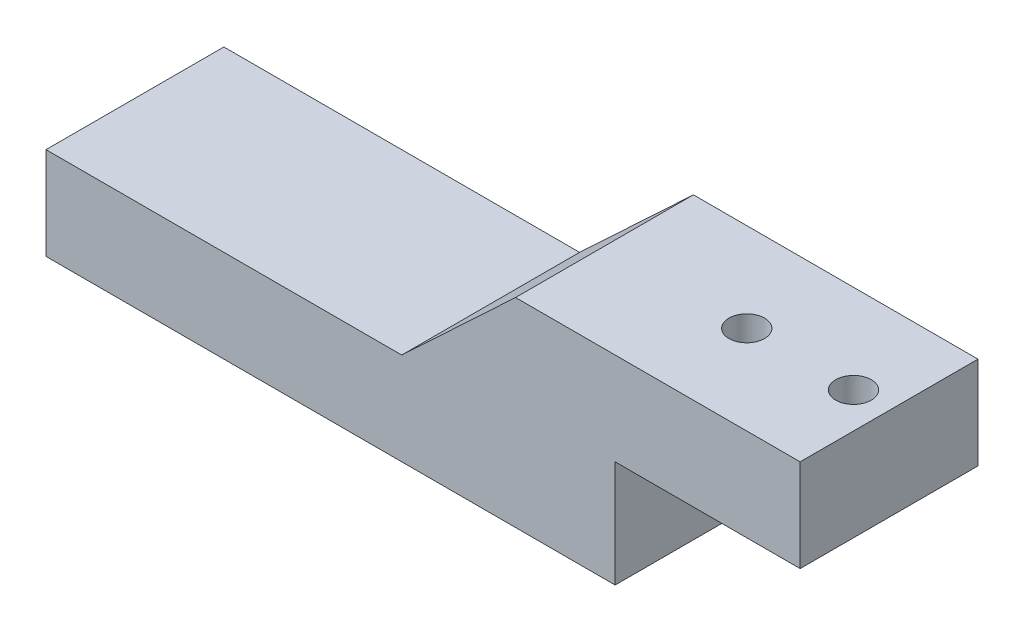
ISO-10303-21;
HEADER;
FILE_DESCRIPTION(('STEP AP214'),'2;1');
FILE_NAME('part.step','',(''),(''),'','','');
FILE_SCHEMA(('AUTOMOTIVE_DESIGN { 1 0 10303 214 1 1 1 1 }'));
ENDSEC;
DATA;
#1=APPLICATION_CONTEXT('core data for automotive mechanical design processes');
#2=APPLICATION_PROTOCOL_DEFINITION('international standard','automotive_design',2000,#1);
#3=PRODUCT_CONTEXT('',#1,'mechanical');
#4=PRODUCT('Part','Part','',(#3));
#5=PRODUCT_RELATED_PRODUCT_CATEGORY('part','',(#4));
#6=PRODUCT_DEFINITION_FORMATION('','',#4);
#7=PRODUCT_DEFINITION_CONTEXT('part definition',#1,'design');
#8=PRODUCT_DEFINITION('design','',#6,#7);
#9=PRODUCT_DEFINITION_SHAPE('','',#8);
#10=(LENGTH_UNIT() NAMED_UNIT(*) SI_UNIT(.MILLI.,.METRE.));
#11=(NAMED_UNIT(*) PLANE_ANGLE_UNIT() SI_UNIT($,.RADIAN.));
#12=(NAMED_UNIT(*) SI_UNIT($,.STERADIAN.) SOLID_ANGLE_UNIT());
#13=UNCERTAINTY_MEASURE_WITH_UNIT(LENGTH_MEASURE(1.E-05),#10,'distance_accuracy_value','');
#14=(GEOMETRIC_REPRESENTATION_CONTEXT(3) GLOBAL_UNCERTAINTY_ASSIGNED_CONTEXT((#13)) GLOBAL_UNIT_ASSIGNED_CONTEXT((#10,
#11,#12)) REPRESENTATION_CONTEXT('',''));
#15=CARTESIAN_POINT('',(0.,0.,0.));
#16=DIRECTION('',(0.,0.,1.));
#17=DIRECTION('',(1.,0.,0.));
#18=AXIS2_PLACEMENT_3D('',#15,#16,#17);
#19=CARTESIAN_POINT('',(0.,0.,25.));
#20=DIRECTION('',(0.,1.,0.));
#21=DIRECTION('',(0.,0.,1.));
#22=AXIS2_PLACEMENT_3D('',#19,#20,#21);
#23=PLANE('',#22);
#24=DIRECTION('',(1.,0.,0.));
#25=VECTOR('',#24,1.);
#26=CARTESIAN_POINT('',(0.,0.,0.));
#27=LINE('',#26,#25);
#28=CARTESIAN_POINT('',(-24.7635869565218,0.,0.));
#29=VERTEX_POINT('',#28);
#30=CARTESIAN_POINT('',(55.2364130434782,0.,0.));
#31=VERTEX_POINT('',#30);
#32=EDGE_CURVE('E84',#29,#31,#27,.T.);
#33=ORIENTED_EDGE('',*,*,#32,.T.);
#34=DIRECTION('',(0.,0.,-1.));
#35=VECTOR('',#34,1.);
#36=CARTESIAN_POINT('',(55.2364130434782,0.,25.));
#37=LINE('',#36,#35);
#38=CARTESIAN_POINT('',(55.2364130434782,0.,25.));
#39=VERTEX_POINT('',#38);
#40=EDGE_CURVE('E11',#39,#31,#37,.T.);
#41=ORIENTED_EDGE('',*,*,#40,.F.);
#42=DIRECTION('',(1.,0.,0.));
#43=VECTOR('',#42,1.);
#44=CARTESIAN_POINT('',(-24.7635869565218,0.,25.));
#45=LINE('',#44,#43);
#46=CARTESIAN_POINT('',(-24.7635869565218,0.,25.));
#47=VERTEX_POINT('',#46);
#48=EDGE_CURVE('E90',#47,#39,#45,.T.);
#49=ORIENTED_EDGE('',*,*,#48,.F.);
#50=DIRECTION('',(0.,0.,-1.));
#51=VECTOR('',#50,1.);
#52=CARTESIAN_POINT('',(-24.7635869565218,0.,25.));
#53=LINE('',#52,#51);
#54=EDGE_CURVE('E124',#47,#29,#53,.T.);
#55=ORIENTED_EDGE('',*,*,#54,.T.);
#56=EDGE_LOOP('',(#33,#41,#49,#55));
#57=FACE_BOUND('',#56,.T.);
#58=ADVANCED_FACE('F32',(#57),#23,.F.);
#59=CARTESIAN_POINT('',(55.2364130434782,0.,25.));
#60=DIRECTION('',(-1.,0.,0.));
#61=DIRECTION('',(0.,0.,1.));
#62=AXIS2_PLACEMENT_3D('',#59,#60,#61);
#63=PLANE('',#62);
#64=DIRECTION('',(0.,1.,0.));
#65=VECTOR('',#64,1.);
#66=CARTESIAN_POINT('',(55.2364130434782,0.,0.));
#67=LINE('',#66,#65);
#68=CARTESIAN_POINT('',(55.2364130434782,15.,0.));
#69=VERTEX_POINT('',#68);
#70=EDGE_CURVE('E129',#31,#69,#67,.T.);
#71=ORIENTED_EDGE('',*,*,#70,.T.);
#72=DIRECTION('',(0.,0.,-1.));
#73=VECTOR('',#72,1.);
#74=CARTESIAN_POINT('',(55.2364130434782,15.,25.));
#75=LINE('',#74,#73);
#76=CARTESIAN_POINT('',(55.2364130434782,15.,25.));
#77=VERTEX_POINT('',#76);
#78=EDGE_CURVE('E40',#77,#69,#75,.T.);
#79=ORIENTED_EDGE('',*,*,#78,.F.);
#80=DIRECTION('',(0.,1.,0.));
#81=VECTOR('',#80,1.);
#82=CARTESIAN_POINT('',(55.2364130434782,0.,25.));
#83=LINE('',#82,#81);
#84=EDGE_CURVE('E174',#39,#77,#83,.T.);
#85=ORIENTED_EDGE('',*,*,#84,.F.);
#86=ORIENTED_EDGE('',*,*,#40,.T.);
#87=EDGE_LOOP('',(#71,#79,#85,#86));
#88=FACE_BOUND('',#87,.T.);
#89=ADVANCED_FACE('F204',(#88),#63,.F.);
#90=CARTESIAN_POINT('',(55.2364130434782,15.,25.));
#91=DIRECTION('',(0.,1.,0.));
#92=DIRECTION('',(0.,0.,1.));
#93=AXIS2_PLACEMENT_3D('',#90,#91,#92);
#94=PLANE('',#93);
#95=CARTESIAN_POINT('',(61.2364130434782,15.,12.5));
#96=DIRECTION('',(0.,1.,0.));
#97=DIRECTION('',(0.,0.,1.));
#98=AXIS2_PLACEMENT_3D('',#95,#96,#97);
#99=CIRCLE('',#98,2.5);
#100=CARTESIAN_POINT('',(58.7364130434782,15.,12.5));
#101=VERTEX_POINT('',#100);
#102=EDGE_CURVE('E182',#101,#101,#99,.T.);
#103=ORIENTED_EDGE('',*,*,#102,.T.);
#104=EDGE_LOOP('',(#103));
#105=FACE_BOUND('',#104,.T.);
#106=CARTESIAN_POINT('',(76.2364130434782,15.,12.5));
#107=DIRECTION('',(0.,1.,0.));
#108=DIRECTION('',(0.,0.,1.));
#109=AXIS2_PLACEMENT_3D('',#106,#107,#108);
#110=CIRCLE('',#109,2.49999999999999);
#111=CARTESIAN_POINT('',(73.7364130434783,15.,12.5));
#112=VERTEX_POINT('',#111);
#113=EDGE_CURVE('E130',#112,#112,#110,.T.);
#114=ORIENTED_EDGE('',*,*,#113,.T.);
#115=EDGE_LOOP('',(#114));
#116=FACE_BOUND('',#115,.T.);
#117=DIRECTION('',(1.,0.,0.));
#118=VECTOR('',#117,1.);
#119=CARTESIAN_POINT('',(55.2364130434782,15.,0.));
#120=LINE('',#119,#118);
#121=CARTESIAN_POINT('',(81.2364130434782,15.,0.));
#122=VERTEX_POINT('',#121);
#123=EDGE_CURVE('E132',#69,#122,#120,.T.);
#124=ORIENTED_EDGE('',*,*,#123,.T.);
#125=DIRECTION('',(0.,0.,-1.));
#126=VECTOR('',#125,1.);
#127=CARTESIAN_POINT('',(81.2364130434782,15.,25.));
#128=LINE('',#127,#126);
#129=CARTESIAN_POINT('',(81.2364130434782,15.,25.));
#130=VERTEX_POINT('',#129);
#131=EDGE_CURVE('E149',#130,#122,#128,.T.);
#132=ORIENTED_EDGE('',*,*,#131,.F.);
#133=DIRECTION('',(1.,0.,0.));
#134=VECTOR('',#133,1.);
#135=CARTESIAN_POINT('',(55.2364130434782,15.,25.));
#136=LINE('',#135,#134);
#137=EDGE_CURVE('E158',#77,#130,#136,.T.);
#138=ORIENTED_EDGE('',*,*,#137,.F.);
#139=ORIENTED_EDGE('',*,*,#78,.T.);
#140=EDGE_LOOP('',(#124,#132,#138,#139));
#141=FACE_BOUND('',#140,.T.);
#142=ADVANCED_FACE('F156',(#105,#116,#141),#94,.F.);
#143=CARTESIAN_POINT('',(81.2364130434782,15.,25.));
#144=DIRECTION('',(-1.,0.,0.));
#145=DIRECTION('',(0.,0.,1.));
#146=AXIS2_PLACEMENT_3D('',#143,#144,#145);
#147=PLANE('',#146);
#148=DIRECTION('',(0.,1.,0.));
#149=VECTOR('',#148,1.);
#150=CARTESIAN_POINT('',(81.2364130434782,15.,0.));
#151=LINE('',#150,#149);
#152=CARTESIAN_POINT('',(81.2364130434782,28.,0.));
#153=VERTEX_POINT('',#152);
#154=EDGE_CURVE('E134',#122,#153,#151,.T.);
#155=ORIENTED_EDGE('',*,*,#154,.T.);
#156=DIRECTION('',(0.,0.,-1.));
#157=VECTOR('',#156,1.);
#158=CARTESIAN_POINT('',(81.2364130434782,28.,25.));
#159=LINE('',#158,#157);
#160=CARTESIAN_POINT('',(81.2364130434782,28.,25.));
#161=VERTEX_POINT('',#160);
#162=EDGE_CURVE('E146',#161,#153,#159,.T.);
#163=ORIENTED_EDGE('',*,*,#162,.F.);
#164=DIRECTION('',(0.,1.,0.));
#165=VECTOR('',#164,1.);
#166=CARTESIAN_POINT('',(81.2364130434782,15.,25.));
#167=LINE('',#166,#165);
#168=EDGE_CURVE('E170',#130,#161,#167,.T.);
#169=ORIENTED_EDGE('',*,*,#168,.F.);
#170=ORIENTED_EDGE('',*,*,#131,.T.);
#171=EDGE_LOOP('',(#155,#163,#169,#170));
#172=FACE_BOUND('',#171,.T.);
#173=ADVANCED_FACE('F166',(#172),#147,.F.);
#174=CARTESIAN_POINT('',(81.2364130434782,28.,25.));
#175=DIRECTION('',(0.,-1.,0.));
#176=DIRECTION('',(1.,0.,0.));
#177=AXIS2_PLACEMENT_3D('',#174,#175,#176);
#178=PLANE('',#177);
#179=CARTESIAN_POINT('',(61.2364130434782,28.,12.5));
#180=DIRECTION('',(0.,1.,0.));
#181=DIRECTION('',(-1.,0.,0.));
#182=AXIS2_PLACEMENT_3D('',#179,#180,#181);
#183=CIRCLE('',#182,2.5);
#184=CARTESIAN_POINT('',(58.7364130434782,28.,12.5));
#185=VERTEX_POINT('',#184);
#186=EDGE_CURVE('E185',#185,#185,#183,.T.);
#187=ORIENTED_EDGE('',*,*,#186,.F.);
#188=EDGE_LOOP('',(#187));
#189=FACE_BOUND('',#188,.T.);
#190=CARTESIAN_POINT('',(76.2364130434782,28.,12.5));
#191=DIRECTION('',(0.,1.,0.));
#192=DIRECTION('',(-1.,0.,0.));
#193=AXIS2_PLACEMENT_3D('',#190,#191,#192);
#194=CIRCLE('',#193,2.49999999999999);
#195=CARTESIAN_POINT('',(73.7364130434783,28.,12.5));
#196=VERTEX_POINT('',#195);
#197=EDGE_CURVE('E179',#196,#196,#194,.T.);
#198=ORIENTED_EDGE('',*,*,#197,.F.);
#199=EDGE_LOOP('',(#198));
#200=FACE_BOUND('',#199,.T.);
#201=DIRECTION('',(-1.,0.,0.));
#202=VECTOR('',#201,1.);
#203=CARTESIAN_POINT('',(81.2364130434782,28.,0.));
#204=LINE('',#203,#202);
#205=CARTESIAN_POINT('',(41.2364130434782,28.,0.));
#206=VERTEX_POINT('',#205);
#207=EDGE_CURVE('E136',#153,#206,#204,.T.);
#208=ORIENTED_EDGE('',*,*,#207,.T.);
#209=DIRECTION('',(0.,0.,-1.));
#210=VECTOR('',#209,1.);
#211=CARTESIAN_POINT('',(41.2364130434782,28.,25.));
#212=LINE('',#211,#210);
#213=CARTESIAN_POINT('',(41.2364130434782,28.,25.));
#214=VERTEX_POINT('',#213);
#215=EDGE_CURVE('E119',#214,#206,#212,.T.);
#216=ORIENTED_EDGE('',*,*,#215,.F.);
#217=DIRECTION('',(-1.,0.,0.));
#218=VECTOR('',#217,1.);
#219=CARTESIAN_POINT('',(81.2364130434782,28.,25.));
#220=LINE('',#219,#218);
#221=EDGE_CURVE('E110',#161,#214,#220,.T.);
#222=ORIENTED_EDGE('',*,*,#221,.F.);
#223=ORIENTED_EDGE('',*,*,#162,.T.);
#224=EDGE_LOOP('',(#208,#216,#222,#223));
#225=FACE_BOUND('',#224,.T.);
#226=ADVANCED_FACE('F169',(#189,#200,#225),#178,.F.);
#227=CARTESIAN_POINT('',(41.2364130434782,28.,25.));
#228=DIRECTION('',(0.68394112888133,-0.729537204140085,0.));
#229=DIRECTION('',(0.729537204140085,0.68394112888133,0.));
#230=AXIS2_PLACEMENT_3D('',#227,#228,#229);
#231=PLANE('',#230);
#232=DIRECTION('',(-0.729537204140085,-0.68394112888133,0.));
#233=VECTOR('',#232,1.);
#234=CARTESIAN_POINT('',(41.2364130434782,28.,0.));
#235=LINE('',#234,#233);
#236=CARTESIAN_POINT('',(25.2364130434783,13.,0.));
#237=VERTEX_POINT('',#236);
#238=EDGE_CURVE('E118',#206,#237,#235,.T.);
#239=ORIENTED_EDGE('',*,*,#238,.T.);
#240=DIRECTION('',(0.,0.,-1.));
#241=VECTOR('',#240,1.);
#242=CARTESIAN_POINT('',(25.2364130434783,13.,25.));
#243=LINE('',#242,#241);
#244=CARTESIAN_POINT('',(25.2364130434783,13.,25.));
#245=VERTEX_POINT('',#244);
#246=EDGE_CURVE('E115',#245,#237,#243,.T.);
#247=ORIENTED_EDGE('',*,*,#246,.F.);
#248=DIRECTION('',(-0.729537204140085,-0.68394112888133,0.));
#249=VECTOR('',#248,1.);
#250=CARTESIAN_POINT('',(41.2364130434782,28.,25.));
#251=LINE('',#250,#249);
#252=EDGE_CURVE('E104',#214,#245,#251,.T.);
#253=ORIENTED_EDGE('',*,*,#252,.F.);
#254=ORIENTED_EDGE('',*,*,#215,.T.);
#255=EDGE_LOOP('',(#239,#247,#253,#254));
#256=FACE_BOUND('',#255,.T.);
#257=ADVANCED_FACE('F116',(#256),#231,.F.);
#258=CARTESIAN_POINT('',(25.2364130434783,13.,25.));
#259=DIRECTION('',(0.,-1.,0.));
#260=DIRECTION('',(1.,0.,0.));
#261=AXIS2_PLACEMENT_3D('',#258,#259,#260);
#262=PLANE('',#261);
#263=DIRECTION('',(-1.,0.,0.));
#264=VECTOR('',#263,1.);
#265=CARTESIAN_POINT('',(25.2364130434783,13.,0.));
#266=LINE('',#265,#264);
#267=CARTESIAN_POINT('',(-24.7635869565218,13.,0.));
#268=VERTEX_POINT('',#267);
#269=EDGE_CURVE('E77',#237,#268,#266,.T.);
#270=ORIENTED_EDGE('',*,*,#269,.T.);
#271=DIRECTION('',(0.,0.,-1.));
#272=VECTOR('',#271,1.);
#273=CARTESIAN_POINT('',(-24.7635869565218,13.,25.));
#274=LINE('',#273,#272);
#275=CARTESIAN_POINT('',(-24.7635869565218,13.,25.));
#276=VERTEX_POINT('',#275);
#277=EDGE_CURVE('E120',#276,#268,#274,.T.);
#278=ORIENTED_EDGE('',*,*,#277,.F.);
#279=DIRECTION('',(-1.,0.,0.));
#280=VECTOR('',#279,1.);
#281=CARTESIAN_POINT('',(25.2364130434783,13.,25.));
#282=LINE('',#281,#280);
#283=EDGE_CURVE('E108',#245,#276,#282,.T.);
#284=ORIENTED_EDGE('',*,*,#283,.F.);
#285=ORIENTED_EDGE('',*,*,#246,.T.);
#286=EDGE_LOOP('',(#270,#278,#284,#285));
#287=FACE_BOUND('',#286,.T.);
#288=ADVANCED_FACE('F122',(#287),#262,.F.);
#289=CARTESIAN_POINT('',(-24.7635869565218,13.,25.));
#290=DIRECTION('',(1.,0.,0.));
#291=DIRECTION('',(0.,1.,0.));
#292=AXIS2_PLACEMENT_3D('',#289,#290,#291);
#293=PLANE('',#292);
#294=DIRECTION('',(0.,-1.,0.));
#295=VECTOR('',#294,1.);
#296=CARTESIAN_POINT('',(-24.7635869565218,13.,0.));
#297=LINE('',#296,#295);
#298=EDGE_CURVE('E140',#268,#29,#297,.T.);
#299=ORIENTED_EDGE('',*,*,#298,.T.);
#300=ORIENTED_EDGE('',*,*,#54,.F.);
#301=DIRECTION('',(0.,-1.,0.));
#302=VECTOR('',#301,1.);
#303=CARTESIAN_POINT('',(-24.7635869565218,13.,25.));
#304=LINE('',#303,#302);
#305=EDGE_CURVE('E48',#276,#47,#304,.T.);
#306=ORIENTED_EDGE('',*,*,#305,.F.);
#307=ORIENTED_EDGE('',*,*,#277,.T.);
#308=EDGE_LOOP('',(#299,#300,#306,#307));
#309=FACE_BOUND('',#308,.T.);
#310=ADVANCED_FACE('F217',(#309),#293,.F.);
#311=CARTESIAN_POINT('',(0.,0.,25.));
#312=DIRECTION('',(0.,0.,1.));
#313=DIRECTION('',(1.,0.,0.));
#314=AXIS2_PLACEMENT_3D('',#311,#312,#313);
#315=PLANE('',#314);
#316=ORIENTED_EDGE('',*,*,#48,.T.);
#317=ORIENTED_EDGE('',*,*,#84,.T.);
#318=ORIENTED_EDGE('',*,*,#137,.T.);
#319=ORIENTED_EDGE('',*,*,#168,.T.);
#320=ORIENTED_EDGE('',*,*,#221,.T.);
#321=ORIENTED_EDGE('',*,*,#252,.T.);
#322=ORIENTED_EDGE('',*,*,#283,.T.);
#323=ORIENTED_EDGE('',*,*,#305,.T.);
#324=EDGE_LOOP('',(#316,#317,#318,#319,#320,#321,#322,#323));
#325=FACE_BOUND('',#324,.T.);
#326=ADVANCED_FACE('F106',(#325),#315,.T.);
#327=CARTESIAN_POINT('',(0.,0.,0.));
#328=DIRECTION('',(0.,0.,1.));
#329=DIRECTION('',(1.,0.,0.));
#330=AXIS2_PLACEMENT_3D('',#327,#328,#329);
#331=PLANE('',#330);
#332=ORIENTED_EDGE('',*,*,#32,.F.);
#333=ORIENTED_EDGE('',*,*,#298,.F.);
#334=ORIENTED_EDGE('',*,*,#269,.F.);
#335=ORIENTED_EDGE('',*,*,#238,.F.);
#336=ORIENTED_EDGE('',*,*,#207,.F.);
#337=ORIENTED_EDGE('',*,*,#154,.F.);
#338=ORIENTED_EDGE('',*,*,#123,.F.);
#339=ORIENTED_EDGE('',*,*,#70,.F.);
#340=EDGE_LOOP('',(#332,#333,#334,#335,#336,#337,#338,#339));
#341=FACE_BOUND('',#340,.T.);
#342=ADVANCED_FACE('F162',(#341),#331,.F.);
#343=CARTESIAN_POINT('',(76.2364130434782,0.,12.5));
#344=DIRECTION('',(0.,1.,0.));
#345=DIRECTION('',(-1.,0.,0.));
#346=AXIS2_PLACEMENT_3D('',#343,#344,#345);
#347=CYLINDRICAL_SURFACE('',#346,2.49999999999999);
#348=CARTESIAN_POINT('',(73.7364130434783,28.,12.5));
#349=CARTESIAN_POINT('',(73.7364130434783,27.8645833333333,12.5));
#350=CARTESIAN_POINT('',(73.7364130434783,27.7291666666667,12.5));
#351=CARTESIAN_POINT('',(73.7364130434783,27.4583333333333,12.5));
#352=CARTESIAN_POINT('',(73.7364130434783,27.3229166666667,12.5));
#353=CARTESIAN_POINT('',(73.7364130434783,27.0520833333333,12.5));
#354=CARTESIAN_POINT('',(73.7364130434783,26.9166666666667,12.5));
#355=CARTESIAN_POINT('',(73.7364130434783,26.6458333333333,12.5));
#356=CARTESIAN_POINT('',(73.7364130434783,26.5104166666667,12.5));
#357=CARTESIAN_POINT('',(73.7364130434783,26.2395833333333,12.5));
#358=CARTESIAN_POINT('',(73.7364130434783,26.1041666666667,12.5));
#359=CARTESIAN_POINT('',(73.7364130434783,25.8333333333333,12.5));
#360=CARTESIAN_POINT('',(73.7364130434783,25.6979166666667,12.5));
#361=CARTESIAN_POINT('',(73.7364130434783,25.4270833333333,12.5));
#362=CARTESIAN_POINT('',(73.7364130434783,25.2916666666667,12.5));
#363=CARTESIAN_POINT('',(73.7364130434783,25.0208333333333,12.5));
#364=CARTESIAN_POINT('',(73.7364130434783,24.8854166666667,12.5));
#365=CARTESIAN_POINT('',(73.7364130434783,24.6145833333333,12.5));
#366=CARTESIAN_POINT('',(73.7364130434783,24.4791666666667,12.5));
#367=CARTESIAN_POINT('',(73.7364130434783,24.2083333333333,12.5));
#368=CARTESIAN_POINT('',(73.7364130434783,24.0729166666667,12.5));
#369=CARTESIAN_POINT('',(73.7364130434783,23.8020833333333,12.5));
#370=CARTESIAN_POINT('',(73.7364130434783,23.6666666666667,12.5));
#371=CARTESIAN_POINT('',(73.7364130434783,23.3958333333333,12.5));
#372=CARTESIAN_POINT('',(73.7364130434783,23.2604166666667,12.5));
#373=CARTESIAN_POINT('',(73.7364130434783,22.9895833333333,12.5));
#374=CARTESIAN_POINT('',(73.7364130434783,22.8541666666667,12.5));
#375=CARTESIAN_POINT('',(73.7364130434783,22.5833333333333,12.5));
#376=CARTESIAN_POINT('',(73.7364130434783,22.4479166666667,12.5));
#377=CARTESIAN_POINT('',(73.7364130434783,22.1770833333333,12.5));
#378=CARTESIAN_POINT('',(73.7364130434783,22.0416666666667,12.5));
#379=CARTESIAN_POINT('',(73.7364130434783,21.7708333333333,12.5));
#380=CARTESIAN_POINT('',(73.7364130434783,21.6354166666667,12.5));
#381=CARTESIAN_POINT('',(73.7364130434783,21.3645833333333,12.5));
#382=CARTESIAN_POINT('',(73.7364130434783,21.2291666666667,12.5));
#383=CARTESIAN_POINT('',(73.7364130434783,20.9583333333333,12.5));
#384=CARTESIAN_POINT('',(73.7364130434783,20.8229166666667,12.5));
#385=CARTESIAN_POINT('',(73.7364130434783,20.5520833333333,12.5));
#386=CARTESIAN_POINT('',(73.7364130434783,20.4166666666667,12.5));
#387=CARTESIAN_POINT('',(73.7364130434783,20.1458333333333,12.5));
#388=CARTESIAN_POINT('',(73.7364130434783,20.0104166666667,12.5));
#389=CARTESIAN_POINT('',(73.7364130434783,19.7395833333333,12.5));
#390=CARTESIAN_POINT('',(73.7364130434783,19.6041666666667,12.5));
#391=CARTESIAN_POINT('',(73.7364130434783,19.3333333333333,12.5));
#392=CARTESIAN_POINT('',(73.7364130434783,19.1979166666667,12.5));
#393=CARTESIAN_POINT('',(73.7364130434783,18.9270833333333,12.5));
#394=CARTESIAN_POINT('',(73.7364130434783,18.7916666666667,12.5));
#395=CARTESIAN_POINT('',(73.7364130434783,18.5208333333333,12.5));
#396=CARTESIAN_POINT('',(73.7364130434783,18.3854166666667,12.5));
#397=CARTESIAN_POINT('',(73.7364130434783,18.1145833333333,12.5));
#398=CARTESIAN_POINT('',(73.7364130434783,17.9791666666667,12.5));
#399=CARTESIAN_POINT('',(73.7364130434783,17.7083333333333,12.5));
#400=CARTESIAN_POINT('',(73.7364130434783,17.5729166666667,12.5));
#401=CARTESIAN_POINT('',(73.7364130434783,17.3020833333333,12.5));
#402=CARTESIAN_POINT('',(73.7364130434783,17.1666666666667,12.5));
#403=CARTESIAN_POINT('',(73.7364130434783,16.8958333333333,12.5));
#404=CARTESIAN_POINT('',(73.7364130434783,16.7604166666667,12.5));
#405=CARTESIAN_POINT('',(73.7364130434783,16.4895833333333,12.5));
#406=CARTESIAN_POINT('',(73.7364130434783,16.3541666666667,12.5));
#407=CARTESIAN_POINT('',(73.7364130434783,16.0833333333333,12.5));
#408=CARTESIAN_POINT('',(73.7364130434783,15.9479166666667,12.5));
#409=CARTESIAN_POINT('',(73.7364130434783,15.6770833333333,12.5));
#410=CARTESIAN_POINT('',(73.7364130434783,15.5416666666667,12.5));
#411=CARTESIAN_POINT('',(73.7364130434783,15.2708333333333,12.5));
#412=CARTESIAN_POINT('',(73.7364130434783,15.1354166666667,12.5));
#413=CARTESIAN_POINT('',(73.7364130434783,15.,12.5));
#414=B_SPLINE_CURVE_WITH_KNOTS('',3,(#348,#349,#350,#351,#352,#353,#354,#355,#356,#357,#358,
#359,#360,#361,#362,#363,#364,#365,#366,#367,#368,#369,#370,#371,#372,#373,#374,#375,#376,#377,
#378,#379,#380,#381,#382,#383,#384,#385,#386,#387,#388,#389,#390,#391,#392,#393,#394,#395,#396,
#397,#398,#399,#400,#401,#402,#403,#404,#405,#406,#407,#408,#409,#410,#411,#412,#413),
.UNSPECIFIED.,.F.,.F.,(4,2,2,2,2,2,2,2,2,2,2,2,2,2,2,2,2,2,2,2,2,2,2,2,2,2,2,2,2,2,2,2,4),(0.,
0.40625,0.812500000000001,1.21875,1.625,2.03125,2.4375,2.84375,3.25,3.65625,4.0625,4.46875,
4.875,5.28125,5.6875,6.09375,6.5,6.90625,7.3125,7.71875,8.125,8.53125,8.9375,9.34375,9.75,
10.15625,10.5625,10.96875,11.375,11.78125,12.1875,12.59375,13.),.UNSPECIFIED.);
#415=EDGE_CURVE('BSEAM197',#196,#112,#414,.T.);
#416=ORIENTED_EDGE('',*,*,#197,.T.);
#417=ORIENTED_EDGE('',*,*,#113,.F.);
#418=ORIENTED_EDGE('',*,*,#415,.T.);
#419=ORIENTED_EDGE('',*,*,#415,.F.);
#420=EDGE_LOOP('',(#416,#418,#417,#419));
#421=FACE_BOUND('',#420,.T.);
#422=ADVANCED_FACE('F197',(#421),#347,.F.);
#423=CARTESIAN_POINT('',(61.2364130434782,0.,12.5));
#424=DIRECTION('',(0.,1.,0.));
#425=DIRECTION('',(-1.,0.,0.));
#426=AXIS2_PLACEMENT_3D('',#423,#424,#425);
#427=CYLINDRICAL_SURFACE('',#426,2.5);
#428=CARTESIAN_POINT('',(58.7364130434782,28.,12.5));
#429=CARTESIAN_POINT('',(58.7364130434782,27.8645833333333,12.5));
#430=CARTESIAN_POINT('',(58.7364130434782,27.7291666666667,12.5));
#431=CARTESIAN_POINT('',(58.7364130434782,27.4583333333333,12.5));
#432=CARTESIAN_POINT('',(58.7364130434782,27.3229166666667,12.5));
#433=CARTESIAN_POINT('',(58.7364130434782,27.0520833333333,12.5));
#434=CARTESIAN_POINT('',(58.7364130434782,26.9166666666667,12.5));
#435=CARTESIAN_POINT('',(58.7364130434782,26.6458333333333,12.5));
#436=CARTESIAN_POINT('',(58.7364130434782,26.5104166666667,12.5));
#437=CARTESIAN_POINT('',(58.7364130434782,26.2395833333333,12.5));
#438=CARTESIAN_POINT('',(58.7364130434782,26.1041666666667,12.5));
#439=CARTESIAN_POINT('',(58.7364130434782,25.8333333333333,12.5));
#440=CARTESIAN_POINT('',(58.7364130434782,25.6979166666667,12.5));
#441=CARTESIAN_POINT('',(58.7364130434782,25.4270833333333,12.5));
#442=CARTESIAN_POINT('',(58.7364130434782,25.2916666666667,12.5));
#443=CARTESIAN_POINT('',(58.7364130434782,25.0208333333333,12.5));
#444=CARTESIAN_POINT('',(58.7364130434782,24.8854166666667,12.5));
#445=CARTESIAN_POINT('',(58.7364130434782,24.6145833333333,12.5));
#446=CARTESIAN_POINT('',(58.7364130434782,24.4791666666667,12.5));
#447=CARTESIAN_POINT('',(58.7364130434782,24.2083333333333,12.5));
#448=CARTESIAN_POINT('',(58.7364130434782,24.0729166666667,12.5));
#449=CARTESIAN_POINT('',(58.7364130434782,23.8020833333333,12.5));
#450=CARTESIAN_POINT('',(58.7364130434782,23.6666666666667,12.5));
#451=CARTESIAN_POINT('',(58.7364130434782,23.3958333333333,12.5));
#452=CARTESIAN_POINT('',(58.7364130434782,23.2604166666667,12.5));
#453=CARTESIAN_POINT('',(58.7364130434782,22.9895833333333,12.5));
#454=CARTESIAN_POINT('',(58.7364130434782,22.8541666666667,12.5));
#455=CARTESIAN_POINT('',(58.7364130434782,22.5833333333333,12.5));
#456=CARTESIAN_POINT('',(58.7364130434782,22.4479166666667,12.5));
#457=CARTESIAN_POINT('',(58.7364130434782,22.1770833333333,12.5));
#458=CARTESIAN_POINT('',(58.7364130434782,22.0416666666667,12.5));
#459=CARTESIAN_POINT('',(58.7364130434782,21.7708333333333,12.5));
#460=CARTESIAN_POINT('',(58.7364130434782,21.6354166666667,12.5));
#461=CARTESIAN_POINT('',(58.7364130434782,21.3645833333333,12.5));
#462=CARTESIAN_POINT('',(58.7364130434782,21.2291666666667,12.5));
#463=CARTESIAN_POINT('',(58.7364130434782,20.9583333333333,12.5));
#464=CARTESIAN_POINT('',(58.7364130434782,20.8229166666667,12.5));
#465=CARTESIAN_POINT('',(58.7364130434782,20.5520833333333,12.5));
#466=CARTESIAN_POINT('',(58.7364130434782,20.4166666666667,12.5));
#467=CARTESIAN_POINT('',(58.7364130434782,20.1458333333333,12.5));
#468=CARTESIAN_POINT('',(58.7364130434782,20.0104166666667,12.5));
#469=CARTESIAN_POINT('',(58.7364130434782,19.7395833333333,12.5));
#470=CARTESIAN_POINT('',(58.7364130434782,19.6041666666667,12.5));
#471=CARTESIAN_POINT('',(58.7364130434782,19.3333333333333,12.5));
#472=CARTESIAN_POINT('',(58.7364130434782,19.1979166666667,12.5));
#473=CARTESIAN_POINT('',(58.7364130434782,18.9270833333333,12.5));
#474=CARTESIAN_POINT('',(58.7364130434782,18.7916666666667,12.5));
#475=CARTESIAN_POINT('',(58.7364130434782,18.5208333333333,12.5));
#476=CARTESIAN_POINT('',(58.7364130434782,18.3854166666667,12.5));
#477=CARTESIAN_POINT('',(58.7364130434782,18.1145833333333,12.5));
#478=CARTESIAN_POINT('',(58.7364130434782,17.9791666666667,12.5));
#479=CARTESIAN_POINT('',(58.7364130434782,17.7083333333333,12.5));
#480=CARTESIAN_POINT('',(58.7364130434782,17.5729166666667,12.5));
#481=CARTESIAN_POINT('',(58.7364130434782,17.3020833333333,12.5));
#482=CARTESIAN_POINT('',(58.7364130434782,17.1666666666667,12.5));
#483=CARTESIAN_POINT('',(58.7364130434782,16.8958333333333,12.5));
#484=CARTESIAN_POINT('',(58.7364130434782,16.7604166666667,12.5));
#485=CARTESIAN_POINT('',(58.7364130434782,16.4895833333333,12.5));
#486=CARTESIAN_POINT('',(58.7364130434782,16.3541666666667,12.5));
#487=CARTESIAN_POINT('',(58.7364130434782,16.0833333333333,12.5));
#488=CARTESIAN_POINT('',(58.7364130434782,15.9479166666667,12.5));
#489=CARTESIAN_POINT('',(58.7364130434782,15.6770833333333,12.5));
#490=CARTESIAN_POINT('',(58.7364130434782,15.5416666666667,12.5));
#491=CARTESIAN_POINT('',(58.7364130434782,15.2708333333333,12.5));
#492=CARTESIAN_POINT('',(58.7364130434782,15.1354166666667,12.5));
#493=CARTESIAN_POINT('',(58.7364130434782,15.,12.5));
#494=B_SPLINE_CURVE_WITH_KNOTS('',3,(#428,#429,#430,#431,#432,#433,#434,#435,#436,#437,#438,
#439,#440,#441,#442,#443,#444,#445,#446,#447,#448,#449,#450,#451,#452,#453,#454,#455,#456,#457,
#458,#459,#460,#461,#462,#463,#464,#465,#466,#467,#468,#469,#470,#471,#472,#473,#474,#475,#476,
#477,#478,#479,#480,#481,#482,#483,#484,#485,#486,#487,#488,#489,#490,#491,#492,#493),
.UNSPECIFIED.,.F.,.F.,(4,2,2,2,2,2,2,2,2,2,2,2,2,2,2,2,2,2,2,2,2,2,2,2,2,2,2,2,2,2,2,2,4),(0.,
0.40625,0.812500000000001,1.21875,1.625,2.03125,2.4375,2.84375,3.25,3.65625,4.0625,4.46875,
4.875,5.28125,5.6875,6.09375,6.5,6.90625,7.3125,7.71875,8.125,8.53125,8.93749999999999,9.34375,
9.74999999999999,10.15625,10.5625,10.96875,11.375,11.78125,12.1875,12.59375,13.),.UNSPECIFIED.);
#495=EDGE_CURVE('BSEAM189',#185,#101,#494,.T.);
#496=ORIENTED_EDGE('',*,*,#186,.T.);
#497=ORIENTED_EDGE('',*,*,#102,.F.);
#498=ORIENTED_EDGE('',*,*,#495,.T.);
#499=ORIENTED_EDGE('',*,*,#495,.F.);
#500=EDGE_LOOP('',(#496,#498,#497,#499));
#501=FACE_BOUND('',#500,.T.);
#502=ADVANCED_FACE('F189',(#501),#427,.F.);
#503=CLOSED_SHELL('',(#58,#89,#142,#173,#226,#257,#288,#310,#326,#342,#422,#502));
#504=MANIFOLD_SOLID_BREP('B2',#503);
#505=ADVANCED_BREP_SHAPE_REPRESENTATION('',(#18,#504),#14);
#506=SHAPE_DEFINITION_REPRESENTATION(#9,#505);
ENDSEC;
END-ISO-10303-21;
